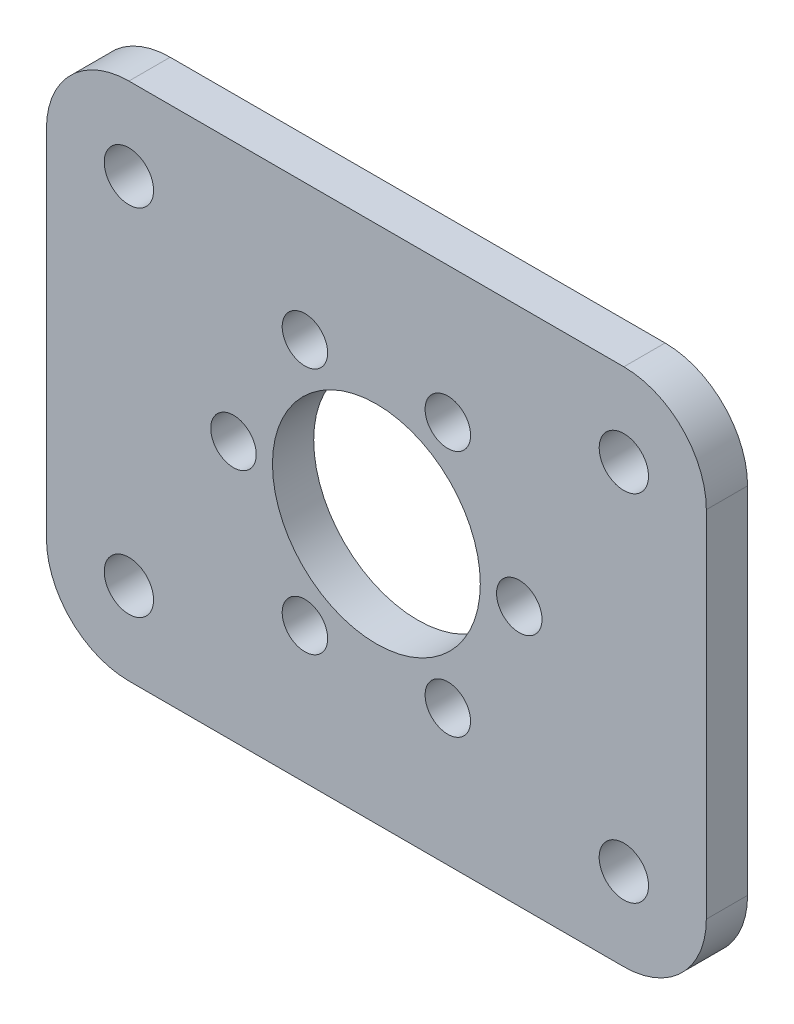
ISO-10303-21;
HEADER;
FILE_DESCRIPTION(('STEP AP214'),'2;1');
FILE_NAME('part.step','',(''),(''),'','','');
FILE_SCHEMA(('AUTOMOTIVE_DESIGN { 1 0 10303 214 1 1 1 1 }'));
ENDSEC;
DATA;
#1=APPLICATION_CONTEXT('core data for automotive mechanical design processes');
#2=APPLICATION_PROTOCOL_DEFINITION('international standard','automotive_design',2000,#1);
#3=PRODUCT_CONTEXT('',#1,'mechanical');
#4=PRODUCT('Part','Part','',(#3));
#5=PRODUCT_RELATED_PRODUCT_CATEGORY('part','',(#4));
#6=PRODUCT_DEFINITION_FORMATION('','',#4);
#7=PRODUCT_DEFINITION_CONTEXT('part definition',#1,'design');
#8=PRODUCT_DEFINITION('design','',#6,#7);
#9=PRODUCT_DEFINITION_SHAPE('','',#8);
#10=(LENGTH_UNIT() NAMED_UNIT(*) SI_UNIT(.MILLI.,.METRE.));
#11=(NAMED_UNIT(*) PLANE_ANGLE_UNIT() SI_UNIT($,.RADIAN.));
#12=(NAMED_UNIT(*) SI_UNIT($,.STERADIAN.) SOLID_ANGLE_UNIT());
#13=UNCERTAINTY_MEASURE_WITH_UNIT(LENGTH_MEASURE(1.E-05),#10,'distance_accuracy_value','');
#14=(GEOMETRIC_REPRESENTATION_CONTEXT(3) GLOBAL_UNCERTAINTY_ASSIGNED_CONTEXT((#13)) GLOBAL_UNIT_ASSIGNED_CONTEXT((#10,
#11,#12)) REPRESENTATION_CONTEXT('',''));
#15=CARTESIAN_POINT('',(0.,0.,0.));
#16=DIRECTION('',(0.,0.,1.));
#17=DIRECTION('',(1.,0.,0.));
#18=AXIS2_PLACEMENT_3D('',#15,#16,#17);
#19=CARTESIAN_POINT('',(-25.4,-20.,3.175));
#20=DIRECTION('',(0.,0.,1.));
#21=DIRECTION('',(1.,0.,0.));
#22=AXIS2_PLACEMENT_3D('',#19,#20,#21);
#23=PLANE('',#22);
#24=CARTESIAN_POINT('',(19.05,13.65,3.175));
#25=DIRECTION('',(0.,0.,1.));
#26=DIRECTION('',(-1.,0.,0.));
#27=AXIS2_PLACEMENT_3D('',#24,#25,#26);
#28=CIRCLE('',#27,1.89865);
#29=CARTESIAN_POINT('',(17.15135,13.65,3.175));
#30=VERTEX_POINT('',#29);
#31=EDGE_CURVE('E237',#30,#30,#28,.T.);
#32=ORIENTED_EDGE('',*,*,#31,.F.);
#33=EDGE_LOOP('',(#32));
#34=FACE_BOUND('',#33,.T.);
#35=CARTESIAN_POINT('',(-19.05,-13.65,3.175));
#36=DIRECTION('',(0.,0.,1.));
#37=DIRECTION('',(-1.,0.,0.));
#38=AXIS2_PLACEMENT_3D('',#35,#36,#37);
#39=CIRCLE('',#38,1.89865);
#40=CARTESIAN_POINT('',(-20.94865,-13.65,3.175));
#41=VERTEX_POINT('',#40);
#42=EDGE_CURVE('E231',#41,#41,#39,.T.);
#43=ORIENTED_EDGE('',*,*,#42,.F.);
#44=EDGE_LOOP('',(#43));
#45=FACE_BOUND('',#44,.T.);
#46=CARTESIAN_POINT('',(-19.05,13.65,3.175));
#47=DIRECTION('',(0.,0.,1.));
#48=DIRECTION('',(1.,0.,0.));
#49=AXIS2_PLACEMENT_3D('',#46,#47,#48);
#50=CIRCLE('',#49,1.89865);
#51=CARTESIAN_POINT('',(-17.15135,13.65,3.175));
#52=VERTEX_POINT('',#51);
#53=EDGE_CURVE('E225',#52,#52,#50,.T.);
#54=ORIENTED_EDGE('',*,*,#53,.F.);
#55=EDGE_LOOP('',(#54));
#56=FACE_BOUND('',#55,.T.);
#57=CARTESIAN_POINT('',(19.05,-13.65,3.175));
#58=DIRECTION('',(0.,0.,1.));
#59=DIRECTION('',(1.,0.,0.));
#60=AXIS2_PLACEMENT_3D('',#57,#58,#59);
#61=CIRCLE('',#60,1.89865);
#62=CARTESIAN_POINT('',(20.94865,-13.65,3.175));
#63=VERTEX_POINT('',#62);
#64=EDGE_CURVE('E219',#63,#63,#61,.T.);
#65=ORIENTED_EDGE('',*,*,#64,.F.);
#66=EDGE_LOOP('',(#65));
#67=FACE_BOUND('',#66,.T.);
#68=CARTESIAN_POINT('',(5.50000000000001,9.52627944162883,3.175));
#69=DIRECTION('',(0.,0.,1.));
#70=DIRECTION('',(1.,0.,0.));
#71=AXIS2_PLACEMENT_3D('',#68,#69,#70);
#72=CIRCLE('',#71,1.75);
#73=CARTESIAN_POINT('',(7.25,9.52627944162883,3.175));
#74=VERTEX_POINT('',#73);
#75=EDGE_CURVE('E213',#74,#74,#72,.T.);
#76=ORIENTED_EDGE('',*,*,#75,.F.);
#77=EDGE_LOOP('',(#76));
#78=FACE_BOUND('',#77,.T.);
#79=CARTESIAN_POINT('',(-5.50000000000001,9.52627944162883,3.175));
#80=DIRECTION('',(0.,0.,1.));
#81=DIRECTION('',(1.,0.,0.));
#82=AXIS2_PLACEMENT_3D('',#79,#80,#81);
#83=CIRCLE('',#82,1.75);
#84=CARTESIAN_POINT('',(-3.75,9.52627944162883,3.175));
#85=VERTEX_POINT('',#84);
#86=EDGE_CURVE('E207',#85,#85,#83,.T.);
#87=ORIENTED_EDGE('',*,*,#86,.F.);
#88=EDGE_LOOP('',(#87));
#89=FACE_BOUND('',#88,.T.);
#90=CARTESIAN_POINT('',(-11.,0.,3.175));
#91=DIRECTION('',(0.,0.,1.));
#92=DIRECTION('',(1.,0.,0.));
#93=AXIS2_PLACEMENT_3D('',#90,#91,#92);
#94=CIRCLE('',#93,1.75);
#95=CARTESIAN_POINT('',(-9.25000000000001,0.,3.175));
#96=VERTEX_POINT('',#95);
#97=EDGE_CURVE('E201',#96,#96,#94,.T.);
#98=ORIENTED_EDGE('',*,*,#97,.F.);
#99=EDGE_LOOP('',(#98));
#100=FACE_BOUND('',#99,.T.);
#101=CARTESIAN_POINT('',(-5.5,-9.52627944162883,3.175));
#102=DIRECTION('',(0.,0.,1.));
#103=DIRECTION('',(1.,0.,0.));
#104=AXIS2_PLACEMENT_3D('',#101,#102,#103);
#105=CIRCLE('',#104,1.75);
#106=CARTESIAN_POINT('',(-3.75,-9.52627944162883,3.175));
#107=VERTEX_POINT('',#106);
#108=EDGE_CURVE('E195',#107,#107,#105,.T.);
#109=ORIENTED_EDGE('',*,*,#108,.F.);
#110=EDGE_LOOP('',(#109));
#111=FACE_BOUND('',#110,.T.);
#112=CARTESIAN_POINT('',(5.5,-9.52627944162883,3.175));
#113=DIRECTION('',(0.,0.,1.));
#114=DIRECTION('',(1.,0.,0.));
#115=AXIS2_PLACEMENT_3D('',#112,#113,#114);
#116=CIRCLE('',#115,1.75);
#117=CARTESIAN_POINT('',(7.25,-9.52627944162883,3.175));
#118=VERTEX_POINT('',#117);
#119=EDGE_CURVE('E189',#118,#118,#116,.T.);
#120=ORIENTED_EDGE('',*,*,#119,.F.);
#121=EDGE_LOOP('',(#120));
#122=FACE_BOUND('',#121,.T.);
#123=CARTESIAN_POINT('',(11.,0.,3.175));
#124=DIRECTION('',(0.,0.,1.));
#125=DIRECTION('',(1.,0.,0.));
#126=AXIS2_PLACEMENT_3D('',#123,#124,#125);
#127=CIRCLE('',#126,1.75);
#128=CARTESIAN_POINT('',(12.75,0.,3.175));
#129=VERTEX_POINT('',#128);
#130=EDGE_CURVE('E183',#129,#129,#127,.T.);
#131=ORIENTED_EDGE('',*,*,#130,.F.);
#132=EDGE_LOOP('',(#131));
#133=FACE_BOUND('',#132,.T.);
#134=DIRECTION('',(0.,-1.,0.));
#135=VECTOR('',#134,1.);
#136=CARTESIAN_POINT('',(-25.4,20.,3.175));
#137=LINE('',#136,#135);
#138=CARTESIAN_POINT('',(-25.4,13.65,3.175));
#139=VERTEX_POINT('',#138);
#140=CARTESIAN_POINT('',(-25.4,-13.65,3.175));
#141=VERTEX_POINT('',#140);
#142=EDGE_CURVE('E137',#139,#141,#137,.T.);
#143=ORIENTED_EDGE('',*,*,#142,.T.);
#144=CARTESIAN_POINT('',(-19.05,-13.65,3.175));
#145=DIRECTION('',(0.,0.,1.));
#146=DIRECTION('',(1.,0.,0.));
#147=AXIS2_PLACEMENT_3D('',#144,#145,#146);
#148=CIRCLE('',#147,6.35);
#149=CARTESIAN_POINT('',(-19.05,-20.,3.175));
#150=VERTEX_POINT('',#149);
#151=EDGE_CURVE('E152',#141,#150,#148,.T.);
#152=ORIENTED_EDGE('',*,*,#151,.T.);
#153=DIRECTION('',(1.,0.,0.));
#154=VECTOR('',#153,1.);
#155=CARTESIAN_POINT('',(-25.4,-20.,3.175));
#156=LINE('',#155,#154);
#157=CARTESIAN_POINT('',(19.05,-20.,3.175));
#158=VERTEX_POINT('',#157);
#159=EDGE_CURVE('E119',#150,#158,#156,.T.);
#160=ORIENTED_EDGE('',*,*,#159,.T.);
#161=CARTESIAN_POINT('',(19.05,-13.65,3.175));
#162=DIRECTION('',(0.,0.,1.));
#163=DIRECTION('',(1.,0.,0.));
#164=AXIS2_PLACEMENT_3D('',#161,#162,#163);
#165=CIRCLE('',#164,6.35);
#166=CARTESIAN_POINT('',(25.4,-13.65,3.175));
#167=VERTEX_POINT('',#166);
#168=EDGE_CURVE('E150',#158,#167,#165,.T.);
#169=ORIENTED_EDGE('',*,*,#168,.T.);
#170=DIRECTION('',(0.,1.,0.));
#171=VECTOR('',#170,1.);
#172=CARTESIAN_POINT('',(25.4,20.,3.175));
#173=LINE('',#172,#171);
#174=CARTESIAN_POINT('',(25.4,13.65,3.175));
#175=VERTEX_POINT('',#174);
#176=EDGE_CURVE('E163',#167,#175,#173,.T.);
#177=ORIENTED_EDGE('',*,*,#176,.T.);
#178=CARTESIAN_POINT('',(19.05,13.65,3.175));
#179=DIRECTION('',(0.,0.,1.));
#180=DIRECTION('',(1.,0.,0.));
#181=AXIS2_PLACEMENT_3D('',#178,#179,#180);
#182=CIRCLE('',#181,6.35);
#183=CARTESIAN_POINT('',(19.05,20.,3.175));
#184=VERTEX_POINT('',#183);
#185=EDGE_CURVE('E54',#175,#184,#182,.T.);
#186=ORIENTED_EDGE('',*,*,#185,.T.);
#187=DIRECTION('',(-1.,0.,0.));
#188=VECTOR('',#187,1.);
#189=CARTESIAN_POINT('',(25.4,20.,3.175));
#190=LINE('',#189,#188);
#191=CARTESIAN_POINT('',(-19.05,20.,3.175));
#192=VERTEX_POINT('',#191);
#193=EDGE_CURVE('E138',#184,#192,#190,.T.);
#194=ORIENTED_EDGE('',*,*,#193,.T.);
#195=CARTESIAN_POINT('',(-19.05,13.65,3.175));
#196=DIRECTION('',(0.,0.,1.));
#197=DIRECTION('',(1.,0.,0.));
#198=AXIS2_PLACEMENT_3D('',#195,#196,#197);
#199=CIRCLE('',#198,6.35);
#200=EDGE_CURVE('E147',#192,#139,#199,.T.);
#201=ORIENTED_EDGE('',*,*,#200,.T.);
#202=EDGE_LOOP('',(#143,#152,#160,#169,#177,#186,#194,#201));
#203=FACE_BOUND('',#202,.T.);
#204=CARTESIAN_POINT('',(0.,0.,3.175));
#205=DIRECTION('',(0.,0.,1.));
#206=DIRECTION('',(1.,0.,0.));
#207=AXIS2_PLACEMENT_3D('',#204,#205,#206);
#208=CIRCLE('',#207,8.);
#209=CARTESIAN_POINT('',(8.,0.,3.175));
#210=VERTEX_POINT('',#209);
#211=EDGE_CURVE('E132',#210,#210,#208,.T.);
#212=ORIENTED_EDGE('',*,*,#211,.F.);
#213=EDGE_LOOP('',(#212));
#214=FACE_BOUND('',#213,.T.);
#215=ADVANCED_FACE('F33',(#34,#45,#56,#67,#78,#89,#100,#111,#122,#133,#203,#214),#23,.T.);
#216=CARTESIAN_POINT('',(-25.4,-20.,0.));
#217=DIRECTION('',(0.,0.,1.));
#218=DIRECTION('',(1.,0.,0.));
#219=AXIS2_PLACEMENT_3D('',#216,#217,#218);
#220=PLANE('',#219);
#221=CARTESIAN_POINT('',(19.05,13.65,0.));
#222=DIRECTION('',(0.,0.,1.));
#223=DIRECTION('',(-1.,0.,0.));
#224=AXIS2_PLACEMENT_3D('',#221,#222,#223);
#225=CIRCLE('',#224,1.89865);
#226=CARTESIAN_POINT('',(17.15135,13.65,0.));
#227=VERTEX_POINT('',#226);
#228=EDGE_CURVE('E222',#227,#227,#225,.T.);
#229=ORIENTED_EDGE('',*,*,#228,.T.);
#230=EDGE_LOOP('',(#229));
#231=FACE_BOUND('',#230,.T.);
#232=CARTESIAN_POINT('',(-19.05,-13.65,0.));
#233=DIRECTION('',(0.,0.,1.));
#234=DIRECTION('',(-1.,0.,0.));
#235=AXIS2_PLACEMENT_3D('',#232,#233,#234);
#236=CIRCLE('',#235,1.89865);
#237=CARTESIAN_POINT('',(-20.94865,-13.65,0.));
#238=VERTEX_POINT('',#237);
#239=EDGE_CURVE('E234',#238,#238,#236,.T.);
#240=ORIENTED_EDGE('',*,*,#239,.T.);
#241=EDGE_LOOP('',(#240));
#242=FACE_BOUND('',#241,.T.);
#243=CARTESIAN_POINT('',(-19.05,13.65,0.));
#244=DIRECTION('',(0.,0.,1.));
#245=DIRECTION('',(1.,0.,0.));
#246=AXIS2_PLACEMENT_3D('',#243,#244,#245);
#247=CIRCLE('',#246,1.89865);
#248=CARTESIAN_POINT('',(-17.15135,13.65,0.));
#249=VERTEX_POINT('',#248);
#250=EDGE_CURVE('E228',#249,#249,#247,.T.);
#251=ORIENTED_EDGE('',*,*,#250,.T.);
#252=EDGE_LOOP('',(#251));
#253=FACE_BOUND('',#252,.T.);
#254=CARTESIAN_POINT('',(19.05,-13.65,0.));
#255=DIRECTION('',(0.,0.,1.));
#256=DIRECTION('',(1.,0.,0.));
#257=AXIS2_PLACEMENT_3D('',#254,#255,#256);
#258=CIRCLE('',#257,1.89865);
#259=CARTESIAN_POINT('',(20.94865,-13.65,0.));
#260=VERTEX_POINT('',#259);
#261=EDGE_CURVE('E216',#260,#260,#258,.T.);
#262=ORIENTED_EDGE('',*,*,#261,.T.);
#263=EDGE_LOOP('',(#262));
#264=FACE_BOUND('',#263,.T.);
#265=CARTESIAN_POINT('',(5.50000000000001,9.52627944162883,0.));
#266=DIRECTION('',(0.,0.,1.));
#267=DIRECTION('',(1.,0.,0.));
#268=AXIS2_PLACEMENT_3D('',#265,#266,#267);
#269=CIRCLE('',#268,1.75);
#270=CARTESIAN_POINT('',(7.25,9.52627944162883,0.));
#271=VERTEX_POINT('',#270);
#272=EDGE_CURVE('E210',#271,#271,#269,.T.);
#273=ORIENTED_EDGE('',*,*,#272,.T.);
#274=EDGE_LOOP('',(#273));
#275=FACE_BOUND('',#274,.T.);
#276=CARTESIAN_POINT('',(-5.50000000000001,9.52627944162883,0.));
#277=DIRECTION('',(0.,0.,1.));
#278=DIRECTION('',(1.,0.,0.));
#279=AXIS2_PLACEMENT_3D('',#276,#277,#278);
#280=CIRCLE('',#279,1.75);
#281=CARTESIAN_POINT('',(-3.75,9.52627944162883,0.));
#282=VERTEX_POINT('',#281);
#283=EDGE_CURVE('E204',#282,#282,#280,.T.);
#284=ORIENTED_EDGE('',*,*,#283,.T.);
#285=EDGE_LOOP('',(#284));
#286=FACE_BOUND('',#285,.T.);
#287=CARTESIAN_POINT('',(-11.,0.,0.));
#288=DIRECTION('',(0.,0.,1.));
#289=DIRECTION('',(1.,0.,0.));
#290=AXIS2_PLACEMENT_3D('',#287,#288,#289);
#291=CIRCLE('',#290,1.75);
#292=CARTESIAN_POINT('',(-9.25000000000001,0.,0.));
#293=VERTEX_POINT('',#292);
#294=EDGE_CURVE('E198',#293,#293,#291,.T.);
#295=ORIENTED_EDGE('',*,*,#294,.T.);
#296=EDGE_LOOP('',(#295));
#297=FACE_BOUND('',#296,.T.);
#298=CARTESIAN_POINT('',(-5.5,-9.52627944162883,0.));
#299=DIRECTION('',(0.,0.,1.));
#300=DIRECTION('',(1.,0.,0.));
#301=AXIS2_PLACEMENT_3D('',#298,#299,#300);
#302=CIRCLE('',#301,1.75);
#303=CARTESIAN_POINT('',(-3.75,-9.52627944162883,0.));
#304=VERTEX_POINT('',#303);
#305=EDGE_CURVE('E192',#304,#304,#302,.T.);
#306=ORIENTED_EDGE('',*,*,#305,.T.);
#307=EDGE_LOOP('',(#306));
#308=FACE_BOUND('',#307,.T.);
#309=CARTESIAN_POINT('',(5.5,-9.52627944162883,0.));
#310=DIRECTION('',(0.,0.,1.));
#311=DIRECTION('',(1.,0.,0.));
#312=AXIS2_PLACEMENT_3D('',#309,#310,#311);
#313=CIRCLE('',#312,1.75);
#314=CARTESIAN_POINT('',(7.25,-9.52627944162883,0.));
#315=VERTEX_POINT('',#314);
#316=EDGE_CURVE('E186',#315,#315,#313,.T.);
#317=ORIENTED_EDGE('',*,*,#316,.T.);
#318=EDGE_LOOP('',(#317));
#319=FACE_BOUND('',#318,.T.);
#320=CARTESIAN_POINT('',(11.,0.,0.));
#321=DIRECTION('',(0.,0.,1.));
#322=DIRECTION('',(1.,0.,0.));
#323=AXIS2_PLACEMENT_3D('',#320,#321,#322);
#324=CIRCLE('',#323,1.75);
#325=CARTESIAN_POINT('',(12.75,0.,0.));
#326=VERTEX_POINT('',#325);
#327=EDGE_CURVE('E180',#326,#326,#324,.T.);
#328=ORIENTED_EDGE('',*,*,#327,.T.);
#329=EDGE_LOOP('',(#328));
#330=FACE_BOUND('',#329,.T.);
#331=DIRECTION('',(1.,0.,0.));
#332=VECTOR('',#331,1.);
#333=CARTESIAN_POINT('',(-25.4,-20.,0.));
#334=LINE('',#333,#332);
#335=CARTESIAN_POINT('',(-19.05,-20.,0.));
#336=VERTEX_POINT('',#335);
#337=CARTESIAN_POINT('',(19.05,-20.,0.));
#338=VERTEX_POINT('',#337);
#339=EDGE_CURVE('E116',#336,#338,#334,.T.);
#340=ORIENTED_EDGE('',*,*,#339,.F.);
#341=CARTESIAN_POINT('',(-19.05,-13.65,0.));
#342=DIRECTION('',(0.,0.,1.));
#343=DIRECTION('',(1.,0.,0.));
#344=AXIS2_PLACEMENT_3D('',#341,#342,#343);
#345=CIRCLE('',#344,6.35);
#346=CARTESIAN_POINT('',(-25.4,-13.65,0.));
#347=VERTEX_POINT('',#346);
#348=EDGE_CURVE('E99',#336,#347,#345,.F.);
#349=ORIENTED_EDGE('',*,*,#348,.T.);
#350=DIRECTION('',(0.,-1.,0.));
#351=VECTOR('',#350,1.);
#352=CARTESIAN_POINT('',(-25.4,20.,0.));
#353=LINE('',#352,#351);
#354=CARTESIAN_POINT('',(-25.4,13.65,0.));
#355=VERTEX_POINT('',#354);
#356=EDGE_CURVE('E127',#355,#347,#353,.T.);
#357=ORIENTED_EDGE('',*,*,#356,.F.);
#358=CARTESIAN_POINT('',(-19.05,13.65,0.));
#359=DIRECTION('',(0.,0.,1.));
#360=DIRECTION('',(1.,0.,0.));
#361=AXIS2_PLACEMENT_3D('',#358,#359,#360);
#362=CIRCLE('',#361,6.35);
#363=CARTESIAN_POINT('',(-19.05,20.,0.));
#364=VERTEX_POINT('',#363);
#365=EDGE_CURVE('E120',#355,#364,#362,.F.);
#366=ORIENTED_EDGE('',*,*,#365,.T.);
#367=DIRECTION('',(-1.,0.,0.));
#368=VECTOR('',#367,1.);
#369=CARTESIAN_POINT('',(25.4,20.,0.));
#370=LINE('',#369,#368);
#371=CARTESIAN_POINT('',(19.05,20.,0.));
#372=VERTEX_POINT('',#371);
#373=EDGE_CURVE('E130',#372,#364,#370,.T.);
#374=ORIENTED_EDGE('',*,*,#373,.F.);
#375=CARTESIAN_POINT('',(19.05,13.65,0.));
#376=DIRECTION('',(0.,0.,1.));
#377=DIRECTION('',(1.,0.,0.));
#378=AXIS2_PLACEMENT_3D('',#375,#376,#377);
#379=CIRCLE('',#378,6.35);
#380=CARTESIAN_POINT('',(25.4,13.65,0.));
#381=VERTEX_POINT('',#380);
#382=EDGE_CURVE('E141',#372,#381,#379,.F.);
#383=ORIENTED_EDGE('',*,*,#382,.T.);
#384=DIRECTION('',(0.,1.,0.));
#385=VECTOR('',#384,1.);
#386=CARTESIAN_POINT('',(25.4,20.,0.));
#387=LINE('',#386,#385);
#388=CARTESIAN_POINT('',(25.4,-13.65,0.));
#389=VERTEX_POINT('',#388);
#390=EDGE_CURVE('E126',#389,#381,#387,.T.);
#391=ORIENTED_EDGE('',*,*,#390,.F.);
#392=CARTESIAN_POINT('',(19.05,-13.65,0.));
#393=DIRECTION('',(0.,0.,1.));
#394=DIRECTION('',(1.,0.,0.));
#395=AXIS2_PLACEMENT_3D('',#392,#393,#394);
#396=CIRCLE('',#395,6.35);
#397=EDGE_CURVE('E110',#389,#338,#396,.F.);
#398=ORIENTED_EDGE('',*,*,#397,.T.);
#399=EDGE_LOOP('',(#340,#349,#357,#366,#374,#383,#391,#398));
#400=FACE_BOUND('',#399,.T.);
#401=CARTESIAN_POINT('',(0.,0.,0.));
#402=DIRECTION('',(0.,0.,1.));
#403=DIRECTION('',(1.,0.,0.));
#404=AXIS2_PLACEMENT_3D('',#401,#402,#403);
#405=CIRCLE('',#404,8.);
#406=CARTESIAN_POINT('',(8.,0.,0.));
#407=VERTEX_POINT('',#406);
#408=EDGE_CURVE('E177',#407,#407,#405,.T.);
#409=ORIENTED_EDGE('',*,*,#408,.T.);
#410=EDGE_LOOP('',(#409));
#411=FACE_BOUND('',#410,.T.);
#412=ADVANCED_FACE('F123',(#231,#242,#253,#264,#275,#286,#297,#308,#319,#330,#400,#411),#220,.F.);
#413=CARTESIAN_POINT('',(-25.4,20.,3.175));
#414=DIRECTION('',(1.,0.,0.));
#415=DIRECTION('',(0.,1.,0.));
#416=AXIS2_PLACEMENT_3D('',#413,#414,#415);
#417=PLANE('',#416);
#418=ORIENTED_EDGE('',*,*,#356,.T.);
#419=DIRECTION('',(0.,0.,-1.));
#420=VECTOR('',#419,1.);
#421=CARTESIAN_POINT('',(-25.4,-13.65,3.175));
#422=LINE('',#421,#420);
#423=EDGE_CURVE('E104',#347,#141,#422,.F.);
#424=ORIENTED_EDGE('',*,*,#423,.T.);
#425=ORIENTED_EDGE('',*,*,#142,.F.);
#426=DIRECTION('',(0.,0.,-1.));
#427=VECTOR('',#426,1.);
#428=CARTESIAN_POINT('',(-25.4,13.65,3.175));
#429=LINE('',#428,#427);
#430=EDGE_CURVE('E109',#139,#355,#429,.T.);
#431=ORIENTED_EDGE('',*,*,#430,.T.);
#432=EDGE_LOOP('',(#418,#424,#425,#431));
#433=FACE_BOUND('',#432,.T.);
#434=ADVANCED_FACE('F282',(#433),#417,.F.);
#435=CARTESIAN_POINT('',(-25.4,-20.,3.175));
#436=DIRECTION('',(0.,1.,0.));
#437=DIRECTION('',(-1.,0.,0.));
#438=AXIS2_PLACEMENT_3D('',#435,#436,#437);
#439=PLANE('',#438);
#440=ORIENTED_EDGE('',*,*,#159,.F.);
#441=DIRECTION('',(0.,0.,-1.));
#442=VECTOR('',#441,1.);
#443=CARTESIAN_POINT('',(-19.05,-20.,3.175));
#444=LINE('',#443,#442);
#445=EDGE_CURVE('E103',#150,#336,#444,.T.);
#446=ORIENTED_EDGE('',*,*,#445,.T.);
#447=ORIENTED_EDGE('',*,*,#339,.T.);
#448=DIRECTION('',(0.,0.,-1.));
#449=VECTOR('',#448,1.);
#450=CARTESIAN_POINT('',(19.05,-20.,3.175));
#451=LINE('',#450,#449);
#452=EDGE_CURVE('E121',#338,#158,#451,.F.);
#453=ORIENTED_EDGE('',*,*,#452,.T.);
#454=EDGE_LOOP('',(#440,#446,#447,#453));
#455=FACE_BOUND('',#454,.T.);
#456=ADVANCED_FACE('F115',(#455),#439,.F.);
#457=CARTESIAN_POINT('',(25.4,20.,3.175));
#458=DIRECTION('',(-1.,0.,0.));
#459=DIRECTION('',(0.,-1.,0.));
#460=AXIS2_PLACEMENT_3D('',#457,#458,#459);
#461=PLANE('',#460);
#462=ORIENTED_EDGE('',*,*,#176,.F.);
#463=DIRECTION('',(0.,0.,-1.));
#464=VECTOR('',#463,1.);
#465=CARTESIAN_POINT('',(25.4,-13.65,3.175));
#466=LINE('',#465,#464);
#467=EDGE_CURVE('E156',#167,#389,#466,.T.);
#468=ORIENTED_EDGE('',*,*,#467,.T.);
#469=ORIENTED_EDGE('',*,*,#390,.T.);
#470=DIRECTION('',(0.,0.,-1.));
#471=VECTOR('',#470,1.);
#472=CARTESIAN_POINT('',(25.4,13.65,3.175));
#473=LINE('',#472,#471);
#474=EDGE_CURVE('E154',#381,#175,#473,.F.);
#475=ORIENTED_EDGE('',*,*,#474,.T.);
#476=EDGE_LOOP('',(#462,#468,#469,#475));
#477=FACE_BOUND('',#476,.T.);
#478=ADVANCED_FACE('F161',(#477),#461,.F.);
#479=CARTESIAN_POINT('',(25.4,20.,3.175));
#480=DIRECTION('',(0.,-1.,0.));
#481=DIRECTION('',(0.,0.,-1.));
#482=AXIS2_PLACEMENT_3D('',#479,#480,#481);
#483=PLANE('',#482);
#484=ORIENTED_EDGE('',*,*,#193,.F.);
#485=DIRECTION('',(0.,0.,-1.));
#486=VECTOR('',#485,1.);
#487=CARTESIAN_POINT('',(19.05,20.,3.175));
#488=LINE('',#487,#486);
#489=EDGE_CURVE('E11',#184,#372,#488,.T.);
#490=ORIENTED_EDGE('',*,*,#489,.T.);
#491=ORIENTED_EDGE('',*,*,#373,.T.);
#492=DIRECTION('',(0.,0.,-1.));
#493=VECTOR('',#492,1.);
#494=CARTESIAN_POINT('',(-19.05,20.,3.175));
#495=LINE('',#494,#493);
#496=EDGE_CURVE('E41',#364,#192,#495,.F.);
#497=ORIENTED_EDGE('',*,*,#496,.T.);
#498=EDGE_LOOP('',(#484,#490,#491,#497));
#499=FACE_BOUND('',#498,.T.);
#500=ADVANCED_FACE('F170',(#499),#483,.F.);
#501=CARTESIAN_POINT('',(0.,0.,3.175));
#502=DIRECTION('',(0.,0.,-1.));
#503=DIRECTION('',(-1.,0.,0.));
#504=AXIS2_PLACEMENT_3D('',#501,#502,#503);
#505=CYLINDRICAL_SURFACE('',#504,8.);
#506=ORIENTED_EDGE('',*,*,#211,.T.);
#507=EDGE_LOOP('',(#506));
#508=FACE_BOUND('',#507,.T.);
#509=ORIENTED_EDGE('',*,*,#408,.F.);
#510=EDGE_LOOP('',(#509));
#511=FACE_BOUND('',#510,.T.);
#512=ADVANCED_FACE('F276',(#508,#511),#505,.F.);
#513=CARTESIAN_POINT('',(-19.05,-13.65,3.175));
#514=DIRECTION('',(0.,0.,-1.));
#515=DIRECTION('',(-1.,0.,0.));
#516=AXIS2_PLACEMENT_3D('',#513,#514,#515);
#517=CYLINDRICAL_SURFACE('',#516,6.35);
#518=ORIENTED_EDGE('',*,*,#151,.F.);
#519=ORIENTED_EDGE('',*,*,#423,.F.);
#520=ORIENTED_EDGE('',*,*,#348,.F.);
#521=ORIENTED_EDGE('',*,*,#445,.F.);
#522=EDGE_LOOP('',(#518,#519,#520,#521));
#523=FACE_BOUND('',#522,.T.);
#524=ADVANCED_FACE('F102',(#523),#517,.T.);
#525=CARTESIAN_POINT('',(19.05,-13.65,3.175));
#526=DIRECTION('',(0.,0.,-1.));
#527=DIRECTION('',(-1.,0.,0.));
#528=AXIS2_PLACEMENT_3D('',#525,#526,#527);
#529=CYLINDRICAL_SURFACE('',#528,6.35);
#530=ORIENTED_EDGE('',*,*,#168,.F.);
#531=ORIENTED_EDGE('',*,*,#452,.F.);
#532=ORIENTED_EDGE('',*,*,#397,.F.);
#533=ORIENTED_EDGE('',*,*,#467,.F.);
#534=EDGE_LOOP('',(#530,#531,#532,#533));
#535=FACE_BOUND('',#534,.T.);
#536=ADVANCED_FACE('F298',(#535),#529,.T.);
#537=CARTESIAN_POINT('',(19.05,13.65,3.175));
#538=DIRECTION('',(0.,0.,-1.));
#539=DIRECTION('',(-1.,0.,0.));
#540=AXIS2_PLACEMENT_3D('',#537,#538,#539);
#541=CYLINDRICAL_SURFACE('',#540,6.35);
#542=ORIENTED_EDGE('',*,*,#185,.F.);
#543=ORIENTED_EDGE('',*,*,#474,.F.);
#544=ORIENTED_EDGE('',*,*,#382,.F.);
#545=ORIENTED_EDGE('',*,*,#489,.F.);
#546=EDGE_LOOP('',(#542,#543,#544,#545));
#547=FACE_BOUND('',#546,.T.);
#548=ADVANCED_FACE('F169',(#547),#541,.T.);
#549=CARTESIAN_POINT('',(-19.05,13.65,3.175));
#550=DIRECTION('',(0.,0.,-1.));
#551=DIRECTION('',(-1.,0.,0.));
#552=AXIS2_PLACEMENT_3D('',#549,#550,#551);
#553=CYLINDRICAL_SURFACE('',#552,6.35);
#554=ORIENTED_EDGE('',*,*,#200,.F.);
#555=ORIENTED_EDGE('',*,*,#496,.F.);
#556=ORIENTED_EDGE('',*,*,#365,.F.);
#557=ORIENTED_EDGE('',*,*,#430,.F.);
#558=EDGE_LOOP('',(#554,#555,#556,#557));
#559=FACE_BOUND('',#558,.T.);
#560=ADVANCED_FACE('F35',(#559),#553,.T.);
#561=CARTESIAN_POINT('',(11.,0.,0.));
#562=DIRECTION('',(0.,0.,1.));
#563=DIRECTION('',(1.,0.,0.));
#564=AXIS2_PLACEMENT_3D('',#561,#562,#563);
#565=CYLINDRICAL_SURFACE('',#564,1.75);
#566=ORIENTED_EDGE('',*,*,#327,.F.);
#567=EDGE_LOOP('',(#566));
#568=FACE_BOUND('',#567,.T.);
#569=ORIENTED_EDGE('',*,*,#130,.T.);
#570=EDGE_LOOP('',(#569));
#571=FACE_BOUND('',#570,.T.);
#572=ADVANCED_FACE('F304',(#568,#571),#565,.F.);
#573=CARTESIAN_POINT('',(5.5,-9.52627944162883,0.));
#574=DIRECTION('',(0.,0.,1.));
#575=DIRECTION('',(1.,0.,0.));
#576=AXIS2_PLACEMENT_3D('',#573,#574,#575);
#577=CYLINDRICAL_SURFACE('',#576,1.75);
#578=ORIENTED_EDGE('',*,*,#316,.F.);
#579=EDGE_LOOP('',(#578));
#580=FACE_BOUND('',#579,.T.);
#581=ORIENTED_EDGE('',*,*,#119,.T.);
#582=EDGE_LOOP('',(#581));
#583=FACE_BOUND('',#582,.T.);
#584=ADVANCED_FACE('F309',(#580,#583),#577,.F.);
#585=CARTESIAN_POINT('',(-5.5,-9.52627944162883,0.));
#586=DIRECTION('',(0.,0.,1.));
#587=DIRECTION('',(1.,0.,0.));
#588=AXIS2_PLACEMENT_3D('',#585,#586,#587);
#589=CYLINDRICAL_SURFACE('',#588,1.75);
#590=ORIENTED_EDGE('',*,*,#305,.F.);
#591=EDGE_LOOP('',(#590));
#592=FACE_BOUND('',#591,.T.);
#593=ORIENTED_EDGE('',*,*,#108,.T.);
#594=EDGE_LOOP('',(#593));
#595=FACE_BOUND('',#594,.T.);
#596=ADVANCED_FACE('F316',(#592,#595),#589,.F.);
#597=CARTESIAN_POINT('',(-11.,0.,0.));
#598=DIRECTION('',(0.,0.,1.));
#599=DIRECTION('',(1.,0.,0.));
#600=AXIS2_PLACEMENT_3D('',#597,#598,#599);
#601=CYLINDRICAL_SURFACE('',#600,1.75);
#602=ORIENTED_EDGE('',*,*,#294,.F.);
#603=EDGE_LOOP('',(#602));
#604=FACE_BOUND('',#603,.T.);
#605=ORIENTED_EDGE('',*,*,#97,.T.);
#606=EDGE_LOOP('',(#605));
#607=FACE_BOUND('',#606,.T.);
#608=ADVANCED_FACE('F324',(#604,#607),#601,.F.);
#609=CARTESIAN_POINT('',(-5.50000000000001,9.52627944162883,0.));
#610=DIRECTION('',(0.,0.,1.));
#611=DIRECTION('',(1.,0.,0.));
#612=AXIS2_PLACEMENT_3D('',#609,#610,#611);
#613=CYLINDRICAL_SURFACE('',#612,1.75);
#614=ORIENTED_EDGE('',*,*,#283,.F.);
#615=EDGE_LOOP('',(#614));
#616=FACE_BOUND('',#615,.T.);
#617=ORIENTED_EDGE('',*,*,#86,.T.);
#618=EDGE_LOOP('',(#617));
#619=FACE_BOUND('',#618,.T.);
#620=ADVANCED_FACE('F328',(#616,#619),#613,.F.);
#621=CARTESIAN_POINT('',(5.50000000000001,9.52627944162883,0.));
#622=DIRECTION('',(0.,0.,1.));
#623=DIRECTION('',(1.,0.,0.));
#624=AXIS2_PLACEMENT_3D('',#621,#622,#623);
#625=CYLINDRICAL_SURFACE('',#624,1.75);
#626=ORIENTED_EDGE('',*,*,#272,.F.);
#627=EDGE_LOOP('',(#626));
#628=FACE_BOUND('',#627,.T.);
#629=ORIENTED_EDGE('',*,*,#75,.T.);
#630=EDGE_LOOP('',(#629));
#631=FACE_BOUND('',#630,.T.);
#632=ADVANCED_FACE('F332',(#628,#631),#625,.F.);
#633=CARTESIAN_POINT('',(19.05,-13.65,0.));
#634=DIRECTION('',(0.,0.,1.));
#635=DIRECTION('',(1.,0.,0.));
#636=AXIS2_PLACEMENT_3D('',#633,#634,#635);
#637=CYLINDRICAL_SURFACE('',#636,1.89865);
#638=ORIENTED_EDGE('',*,*,#261,.F.);
#639=EDGE_LOOP('',(#638));
#640=FACE_BOUND('',#639,.T.);
#641=ORIENTED_EDGE('',*,*,#64,.T.);
#642=EDGE_LOOP('',(#641));
#643=FACE_BOUND('',#642,.T.);
#644=ADVANCED_FACE('F336',(#640,#643),#637,.F.);
#645=CARTESIAN_POINT('',(-19.05,13.65,0.));
#646=DIRECTION('',(0.,0.,1.));
#647=DIRECTION('',(1.,0.,0.));
#648=AXIS2_PLACEMENT_3D('',#645,#646,#647);
#649=CYLINDRICAL_SURFACE('',#648,1.89865);
#650=ORIENTED_EDGE('',*,*,#250,.F.);
#651=EDGE_LOOP('',(#650));
#652=FACE_BOUND('',#651,.T.);
#653=ORIENTED_EDGE('',*,*,#53,.T.);
#654=EDGE_LOOP('',(#653));
#655=FACE_BOUND('',#654,.T.);
#656=ADVANCED_FACE('F340',(#652,#655),#649,.F.);
#657=CARTESIAN_POINT('',(-19.05,-13.65,0.));
#658=DIRECTION('',(0.,0.,1.));
#659=DIRECTION('',(1.,0.,0.));
#660=AXIS2_PLACEMENT_3D('',#657,#658,#659);
#661=CYLINDRICAL_SURFACE('',#660,1.89865);
#662=ORIENTED_EDGE('',*,*,#239,.F.);
#663=EDGE_LOOP('',(#662));
#664=FACE_BOUND('',#663,.T.);
#665=ORIENTED_EDGE('',*,*,#42,.T.);
#666=EDGE_LOOP('',(#665));
#667=FACE_BOUND('',#666,.T.);
#668=ADVANCED_FACE('F248',(#664,#667),#661,.F.);
#669=CARTESIAN_POINT('',(19.05,13.65,0.));
#670=DIRECTION('',(0.,0.,1.));
#671=DIRECTION('',(1.,0.,0.));
#672=AXIS2_PLACEMENT_3D('',#669,#670,#671);
#673=CYLINDRICAL_SURFACE('',#672,1.89865);
#674=ORIENTED_EDGE('',*,*,#228,.F.);
#675=EDGE_LOOP('',(#674));
#676=FACE_BOUND('',#675,.T.);
#677=ORIENTED_EDGE('',*,*,#31,.T.);
#678=EDGE_LOOP('',(#677));
#679=FACE_BOUND('',#678,.T.);
#680=ADVANCED_FACE('F245',(#676,#679),#673,.F.);
#681=CLOSED_SHELL('',(#215,#412,#434,#456,#478,#500,#512,#524,#536,#548,#560,#572,#584,#596,
#608,#620,#632,#644,#656,#668,#680));
#682=MANIFOLD_SOLID_BREP('B2',#681);
#683=ADVANCED_BREP_SHAPE_REPRESENTATION('',(#18,#682),#14);
#684=SHAPE_DEFINITION_REPRESENTATION(#9,#683);
ENDSEC;
END-ISO-10303-21;
